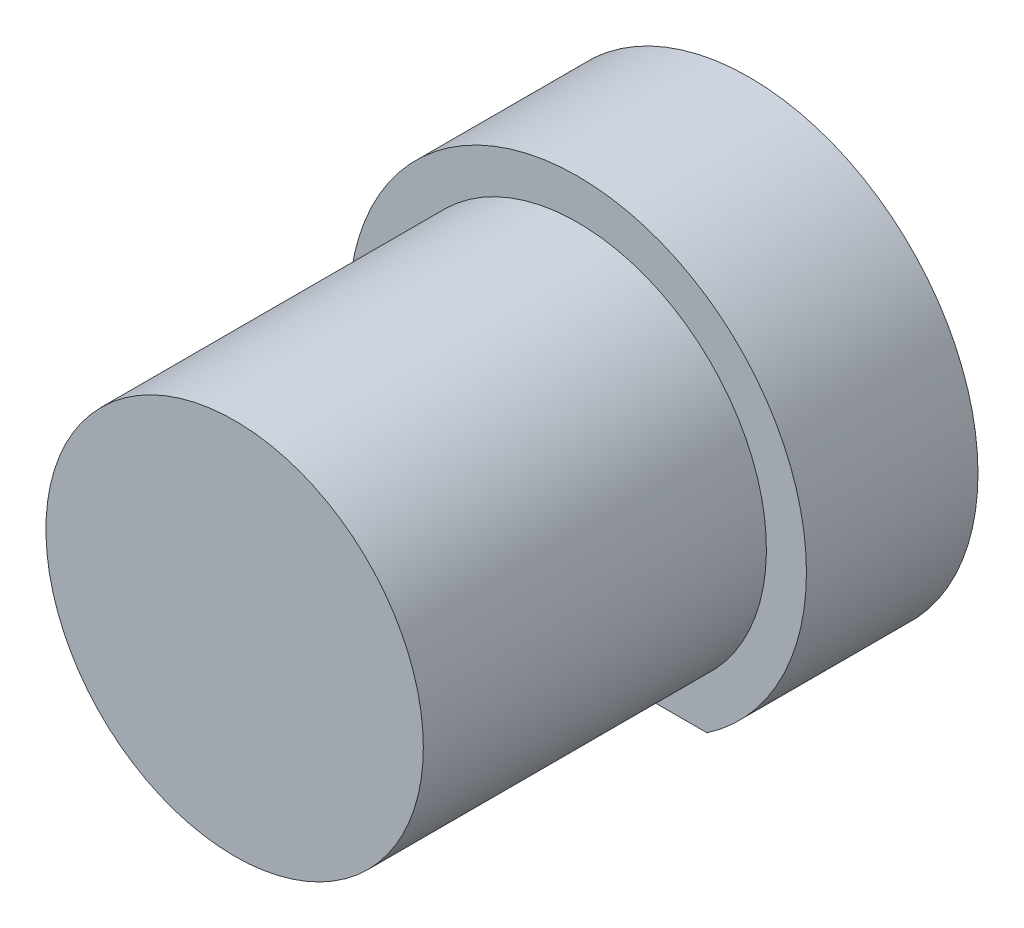
ISO-10303-21;
HEADER;
FILE_DESCRIPTION(('STEP AP214'),'2;1');
FILE_NAME('part.step','',(''),(''),'','','');
FILE_SCHEMA(('AUTOMOTIVE_DESIGN { 1 0 10303 214 1 1 1 1 }'));
ENDSEC;
DATA;
#1=APPLICATION_CONTEXT('core data for automotive mechanical design processes');
#2=APPLICATION_PROTOCOL_DEFINITION('international standard','automotive_design',2000,#1);
#3=PRODUCT_CONTEXT('',#1,'mechanical');
#4=PRODUCT('Part','Part','',(#3));
#5=PRODUCT_RELATED_PRODUCT_CATEGORY('part','',(#4));
#6=PRODUCT_DEFINITION_FORMATION('','',#4);
#7=PRODUCT_DEFINITION_CONTEXT('part definition',#1,'design');
#8=PRODUCT_DEFINITION('design','',#6,#7);
#9=PRODUCT_DEFINITION_SHAPE('','',#8);
#10=(LENGTH_UNIT() NAMED_UNIT(*) SI_UNIT(.MILLI.,.METRE.));
#11=(NAMED_UNIT(*) PLANE_ANGLE_UNIT() SI_UNIT($,.RADIAN.));
#12=(NAMED_UNIT(*) SI_UNIT($,.STERADIAN.) SOLID_ANGLE_UNIT());
#13=UNCERTAINTY_MEASURE_WITH_UNIT(LENGTH_MEASURE(1.E-05),#10,'distance_accuracy_value','');
#14=(GEOMETRIC_REPRESENTATION_CONTEXT(3) GLOBAL_UNCERTAINTY_ASSIGNED_CONTEXT((#13)) GLOBAL_UNIT_ASSIGNED_CONTEXT((#10,
#11,#12)) REPRESENTATION_CONTEXT('',''));
#15=CARTESIAN_POINT('',(0.,0.,0.));
#16=DIRECTION('',(0.,0.,1.));
#17=DIRECTION('',(1.,0.,0.));
#18=AXIS2_PLACEMENT_3D('',#15,#16,#17);
#19=CARTESIAN_POINT('',(0.,0.,1.5));
#20=DIRECTION('',(0.,0.,-1.));
#21=DIRECTION('',(-1.,0.,0.));
#22=AXIS2_PLACEMENT_3D('',#19,#20,#21);
#23=CYLINDRICAL_SURFACE('',#22,2.);
#24=CARTESIAN_POINT('',(0.,0.,1.5));
#25=DIRECTION('',(0.,0.,1.));
#26=DIRECTION('',(1.,0.,0.));
#27=AXIS2_PLACEMENT_3D('',#24,#25,#26);
#28=CIRCLE('',#27,2.);
#29=CARTESIAN_POINT('',(1.13026545554573,-1.65,1.5));
#30=VERTEX_POINT('',#29);
#31=CARTESIAN_POINT('',(-1.13026545554573,-1.65,1.5));
#32=VERTEX_POINT('',#31);
#33=EDGE_CURVE('E41',#30,#32,#28,.T.);
#34=ORIENTED_EDGE('',*,*,#33,.F.);
#35=DIRECTION('',(0.,0.,1.));
#36=VECTOR('',#35,1.);
#37=CARTESIAN_POINT('',(1.13026545554573,-1.65,-2.28746584673957));
#38=LINE('',#37,#36);
#39=CARTESIAN_POINT('',(1.13026545554573,-1.65,0.));
#40=VERTEX_POINT('',#39);
#41=EDGE_CURVE('E63',#40,#30,#38,.T.);
#42=ORIENTED_EDGE('',*,*,#41,.F.);
#43=CARTESIAN_POINT('',(0.,0.,0.));
#44=DIRECTION('',(0.,0.,1.));
#45=DIRECTION('',(1.,0.,0.));
#46=AXIS2_PLACEMENT_3D('',#43,#44,#45);
#47=CIRCLE('',#46,2.);
#48=CARTESIAN_POINT('',(-1.13026545554573,-1.65,0.));
#49=VERTEX_POINT('',#48);
#50=EDGE_CURVE('E36',#40,#49,#47,.T.);
#51=ORIENTED_EDGE('',*,*,#50,.T.);
#52=DIRECTION('',(0.,0.,1.));
#53=VECTOR('',#52,1.);
#54=CARTESIAN_POINT('',(-1.13026545554573,-1.65,-2.28746584673957));
#55=LINE('',#54,#53);
#56=EDGE_CURVE('E49',#49,#32,#55,.T.);
#57=ORIENTED_EDGE('',*,*,#56,.T.);
#58=EDGE_LOOP('',(#34,#42,#51,#57));
#59=FACE_BOUND('',#58,.T.);
#60=ADVANCED_FACE('F33',(#59),#23,.T.);
#61=CARTESIAN_POINT('',(0.,0.,1.5));
#62=DIRECTION('',(0.,0.,1.));
#63=DIRECTION('',(1.,0.,0.));
#64=AXIS2_PLACEMENT_3D('',#61,#62,#63);
#65=PLANE('',#64);
#66=DIRECTION('',(-1.,0.,0.));
#67=VECTOR('',#66,1.);
#68=CARTESIAN_POINT('',(-1.13026545554573,-1.65,1.5));
#69=LINE('',#68,#67);
#70=CARTESIAN_POINT('',(0.,-1.65,1.5));
#71=VERTEX_POINT('',#70);
#72=EDGE_CURVE('E55',#30,#71,#69,.T.);
#73=ORIENTED_EDGE('',*,*,#72,.F.);
#74=ORIENTED_EDGE('',*,*,#33,.T.);
#75=EDGE_CURVE('E75',#71,#32,#69,.T.);
#76=ORIENTED_EDGE('',*,*,#75,.F.);
#77=CARTESIAN_POINT('',(0.,0.,1.5));
#78=DIRECTION('',(0.,0.,1.));
#79=DIRECTION('',(1.,0.,0.));
#80=AXIS2_PLACEMENT_3D('',#77,#78,#79);
#81=CIRCLE('',#80,1.65);
#82=EDGE_CURVE('E11',#71,#71,#81,.T.);
#83=ORIENTED_EDGE('',*,*,#82,.F.);
#84=EDGE_LOOP('',(#73,#74,#76,#83));
#85=FACE_BOUND('',#84,.T.);
#86=ADVANCED_FACE('F74',(#85),#65,.T.);
#87=CARTESIAN_POINT('',(0.,0.,0.));
#88=DIRECTION('',(0.,0.,1.));
#89=DIRECTION('',(1.,0.,0.));
#90=AXIS2_PLACEMENT_3D('',#87,#88,#89);
#91=PLANE('',#90);
#92=ORIENTED_EDGE('',*,*,#50,.F.);
#93=DIRECTION('',(1.,0.,0.));
#94=VECTOR('',#93,1.);
#95=CARTESIAN_POINT('',(-1.13026545554573,-1.65,0.));
#96=LINE('',#95,#94);
#97=EDGE_CURVE('E65',#49,#40,#96,.T.);
#98=ORIENTED_EDGE('',*,*,#97,.F.);
#99=EDGE_LOOP('',(#92,#98));
#100=FACE_BOUND('',#99,.T.);
#101=ADVANCED_FACE('F89',(#100),#91,.F.);
#102=CARTESIAN_POINT('',(0.,0.,4.5));
#103=DIRECTION('',(0.,0.,-1.));
#104=DIRECTION('',(-1.,0.,0.));
#105=AXIS2_PLACEMENT_3D('',#102,#103,#104);
#106=CYLINDRICAL_SURFACE('',#105,1.65);
#107=CARTESIAN_POINT('',(0.,0.,4.5));
#108=DIRECTION('',(0.,0.,1.));
#109=DIRECTION('',(1.,0.,0.));
#110=AXIS2_PLACEMENT_3D('',#107,#108,#109);
#111=CIRCLE('',#110,1.65);
#112=CARTESIAN_POINT('',(1.65,0.,4.5));
#113=VERTEX_POINT('',#112);
#114=EDGE_CURVE('E77',#113,#113,#111,.T.);
#115=ORIENTED_EDGE('',*,*,#114,.F.);
#116=EDGE_LOOP('',(#115));
#117=FACE_BOUND('',#116,.T.);
#118=ORIENTED_EDGE('',*,*,#82,.T.);
#119=EDGE_LOOP('',(#118));
#120=FACE_BOUND('',#119,.T.);
#121=ADVANCED_FACE('F86',(#117,#120),#106,.T.);
#122=CARTESIAN_POINT('',(0.,0.,4.5));
#123=DIRECTION('',(0.,0.,1.));
#124=DIRECTION('',(1.,0.,0.));
#125=AXIS2_PLACEMENT_3D('',#122,#123,#124);
#126=PLANE('',#125);
#127=ORIENTED_EDGE('',*,*,#114,.T.);
#128=EDGE_LOOP('',(#127));
#129=FACE_BOUND('',#128,.T.);
#130=ADVANCED_FACE('F84',(#129),#126,.T.);
#131=CARTESIAN_POINT('',(-1.13026545554573,-1.65,-2.28746584673957));
#132=DIRECTION('',(0.,1.,0.));
#133=DIRECTION('',(0.,0.,1.));
#134=AXIS2_PLACEMENT_3D('',#131,#132,#133);
#135=PLANE('',#134);
#136=ORIENTED_EDGE('',*,*,#97,.T.);
#137=ORIENTED_EDGE('',*,*,#41,.T.);
#138=ORIENTED_EDGE('',*,*,#72,.T.);
#139=ORIENTED_EDGE('',*,*,#75,.T.);
#140=ORIENTED_EDGE('',*,*,#56,.F.);
#141=EDGE_LOOP('',(#136,#137,#138,#139,#140));
#142=FACE_BOUND('',#141,.T.);
#143=ADVANCED_FACE('F64',(#142),#135,.F.);
#144=CLOSED_SHELL('',(#60,#86,#101,#121,#130,#143));
#145=MANIFOLD_SOLID_BREP('B2',#144);
#146=ADVANCED_BREP_SHAPE_REPRESENTATION('',(#18,#145),#14);
#147=SHAPE_DEFINITION_REPRESENTATION(#9,#146);
ENDSEC;
END-ISO-10303-21;
